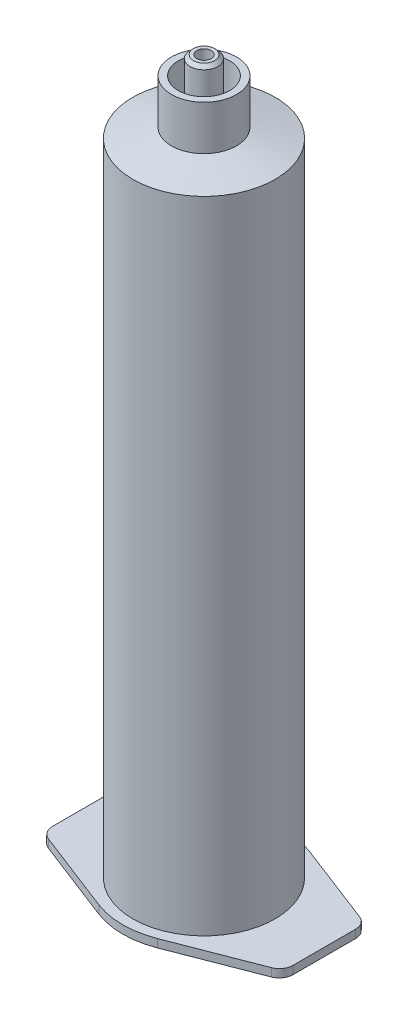
ISO-10303-21;
HEADER;
FILE_DESCRIPTION(('STEP AP214'),'2;1');
FILE_NAME('part.step','',(''),(''),'','','');
FILE_SCHEMA(('AUTOMOTIVE_DESIGN { 1 0 10303 214 1 1 1 1 }'));
ENDSEC;
DATA;
#1=APPLICATION_CONTEXT('core data for automotive mechanical design processes');
#2=APPLICATION_PROTOCOL_DEFINITION('international standard','automotive_design',2000,#1);
#3=PRODUCT_CONTEXT('',#1,'mechanical');
#4=PRODUCT('Part','Part','',(#3));
#5=PRODUCT_RELATED_PRODUCT_CATEGORY('part','',(#4));
#6=PRODUCT_DEFINITION_FORMATION('','',#4);
#7=PRODUCT_DEFINITION_CONTEXT('part definition',#1,'design');
#8=PRODUCT_DEFINITION('design','',#6,#7);
#9=PRODUCT_DEFINITION_SHAPE('','',#8);
#10=(LENGTH_UNIT() NAMED_UNIT(*) SI_UNIT(.MILLI.,.METRE.));
#11=(NAMED_UNIT(*) PLANE_ANGLE_UNIT() SI_UNIT($,.RADIAN.));
#12=(NAMED_UNIT(*) SI_UNIT($,.STERADIAN.) SOLID_ANGLE_UNIT());
#13=UNCERTAINTY_MEASURE_WITH_UNIT(LENGTH_MEASURE(1.E-05),#10,'distance_accuracy_value','');
#14=(GEOMETRIC_REPRESENTATION_CONTEXT(3) GLOBAL_UNCERTAINTY_ASSIGNED_CONTEXT((#13)) GLOBAL_UNIT_ASSIGNED_CONTEXT((#10,
#11,#12)) REPRESENTATION_CONTEXT('',''));
#15=CARTESIAN_POINT('',(0.,0.,0.));
#16=DIRECTION('',(0.,0.,1.));
#17=DIRECTION('',(1.,0.,0.));
#18=AXIS2_PLACEMENT_3D('',#15,#16,#17);
#19=CARTESIAN_POINT('',(0.,0.,0.));
#20=DIRECTION('',(0.,1.,0.));
#21=DIRECTION('',(0.,0.,1.));
#22=AXIS2_PLACEMENT_3D('',#19,#20,#21);
#23=CYLINDRICAL_SURFACE('',#22,3.8);
#24=CARTESIAN_POINT('',(0.,-3.44787174276673,0.));
#25=DIRECTION('',(0.,1.,0.));
#26=DIRECTION('',(0.,0.,1.));
#27=AXIS2_PLACEMENT_3D('',#24,#25,#26);
#28=CIRCLE('',#27,3.8);
#29=CARTESIAN_POINT('',(0.,-3.44787174276673,3.8));
#30=VERTEX_POINT('',#29);
#31=EDGE_CURVE('E210',#30,#30,#28,.T.);
#32=ORIENTED_EDGE('',*,*,#31,.F.);
#33=EDGE_LOOP('',(#32));
#34=FACE_BOUND('',#33,.T.);
#35=CARTESIAN_POINT('',(0.,2.8706391928476,0.));
#36=DIRECTION('',(0.,1.,0.));
#37=DIRECTION('',(0.,0.,1.));
#38=AXIS2_PLACEMENT_3D('',#35,#36,#37);
#39=CIRCLE('',#38,3.8);
#40=CARTESIAN_POINT('',(0.,2.8706391928476,3.8));
#41=VERTEX_POINT('',#40);
#42=EDGE_CURVE('E11',#41,#41,#39,.T.);
#43=ORIENTED_EDGE('',*,*,#42,.T.);
#44=EDGE_LOOP('',(#43));
#45=FACE_BOUND('',#44,.T.);
#46=ADVANCED_FACE('F37',(#34,#45),#23,.F.);
#47=CARTESIAN_POINT('',(3.8,2.8706391928476,0.));
#48=DIRECTION('',(0.,-1.,0.));
#49=DIRECTION('',(0.,0.,-1.));
#50=AXIS2_PLACEMENT_3D('',#47,#48,#49);
#51=PLANE('',#50);
#52=ORIENTED_EDGE('',*,*,#42,.F.);
#53=EDGE_LOOP('',(#52));
#54=FACE_BOUND('',#53,.T.);
#55=CARTESIAN_POINT('',(0.,2.8706391928476,0.));
#56=DIRECTION('',(0.,1.,0.));
#57=DIRECTION('',(0.,0.,1.));
#58=AXIS2_PLACEMENT_3D('',#55,#56,#57);
#59=CIRCLE('',#58,4.8);
#60=CARTESIAN_POINT('',(0.,2.8706391928476,4.8));
#61=VERTEX_POINT('',#60);
#62=EDGE_CURVE('E45',#61,#61,#59,.T.);
#63=ORIENTED_EDGE('',*,*,#62,.T.);
#64=EDGE_LOOP('',(#63));
#65=FACE_BOUND('',#64,.T.);
#66=ADVANCED_FACE('F241',(#54,#65),#51,.F.);
#67=CARTESIAN_POINT('',(0.,0.,0.));
#68=DIRECTION('',(0.,1.,0.));
#69=DIRECTION('',(0.,0.,1.));
#70=AXIS2_PLACEMENT_3D('',#67,#68,#69);
#71=CYLINDRICAL_SURFACE('',#70,4.8);
#72=ORIENTED_EDGE('',*,*,#62,.F.);
#73=EDGE_LOOP('',(#72));
#74=FACE_BOUND('',#73,.T.);
#75=CARTESIAN_POINT('',(0.,-3.69884025983921,0.));
#76=DIRECTION('',(0.,1.,0.));
#77=DIRECTION('',(0.,0.,1.));
#78=AXIS2_PLACEMENT_3D('',#75,#76,#77);
#79=CIRCLE('',#78,4.8);
#80=CARTESIAN_POINT('',(0.,-3.69884025983921,4.8));
#81=VERTEX_POINT('',#80);
#82=EDGE_CURVE('E236',#81,#81,#79,.T.);
#83=ORIENTED_EDGE('',*,*,#82,.T.);
#84=EDGE_LOOP('',(#83));
#85=FACE_BOUND('',#84,.T.);
#86=ADVANCED_FACE('F243',(#74,#85),#71,.T.);
#87=CARTESIAN_POINT('',(0.,-5.12936080715239,0.));
#88=DIRECTION('',(0.,-1.,0.));
#89=DIRECTION('',(0.,0.,-1.));
#90=AXIS2_PLACEMENT_3D('',#87,#88,#89);
#91=CONICAL_SURFACE('',#90,10.5,1.32490632612181);
#92=ORIENTED_EDGE('',*,*,#82,.F.);
#93=EDGE_LOOP('',(#92));
#94=FACE_BOUND('',#93,.T.);
#95=CARTESIAN_POINT('',(0.,-5.12936080715239,0.));
#96=DIRECTION('',(0.,1.,0.));
#97=DIRECTION('',(0.,0.,1.));
#98=AXIS2_PLACEMENT_3D('',#95,#96,#97);
#99=CIRCLE('',#98,10.5);
#100=CARTESIAN_POINT('',(0.,-5.12936080715239,10.5));
#101=VERTEX_POINT('',#100);
#102=EDGE_CURVE('E231',#101,#101,#99,.T.);
#103=ORIENTED_EDGE('',*,*,#102,.T.);
#104=EDGE_LOOP('',(#103));
#105=FACE_BOUND('',#104,.T.);
#106=ADVANCED_FACE('F246',(#94,#105),#91,.T.);
#107=CARTESIAN_POINT('',(0.,0.,0.));
#108=DIRECTION('',(0.,1.,0.));
#109=DIRECTION('',(0.,0.,1.));
#110=AXIS2_PLACEMENT_3D('',#107,#108,#109);
#111=CYLINDRICAL_SURFACE('',#110,10.5);
#112=ORIENTED_EDGE('',*,*,#102,.F.);
#113=EDGE_LOOP('',(#112));
#114=FACE_BOUND('',#113,.T.);
#115=CARTESIAN_POINT('',(0.,-99.6293608071524,0.));
#116=DIRECTION('',(0.,1.,0.));
#117=DIRECTION('',(0.,0.,1.));
#118=AXIS2_PLACEMENT_3D('',#115,#116,#117);
#119=CIRCLE('',#118,10.5);
#120=CARTESIAN_POINT('',(0.,-99.6293608071524,10.5));
#121=VERTEX_POINT('',#120);
#122=EDGE_CURVE('E209',#121,#121,#119,.T.);
#123=ORIENTED_EDGE('',*,*,#122,.T.);
#124=EDGE_LOOP('',(#123));
#125=FACE_BOUND('',#124,.T.);
#126=ADVANCED_FACE('F252',(#114,#125),#111,.T.);
#127=CARTESIAN_POINT('',(0.,0.,0.));
#128=DIRECTION('',(0.,1.,0.));
#129=DIRECTION('',(0.,0.,1.));
#130=AXIS2_PLACEMENT_3D('',#127,#128,#129);
#131=CYLINDRICAL_SURFACE('',#130,9.50000000000001);
#132=CARTESIAN_POINT('',(0.,-5.90940402452407,0.));
#133=DIRECTION('',(0.,1.,0.));
#134=DIRECTION('',(0.,0.,1.));
#135=AXIS2_PLACEMENT_3D('',#132,#133,#134);
#136=CIRCLE('',#135,9.5);
#137=CARTESIAN_POINT('',(0.,-5.90940402452407,-9.5));
#138=VERTEX_POINT('',#137);
#139=EDGE_CURVE('E228',#138,#138,#136,.T.);
#140=ORIENTED_EDGE('',*,*,#139,.T.);
#141=EDGE_LOOP('',(#140));
#142=FACE_BOUND('',#141,.T.);
#143=CARTESIAN_POINT('',(0.,-100.829360807152,0.));
#144=DIRECTION('',(0.,-1.,0.));
#145=DIRECTION('',(0.,0.,-1.));
#146=AXIS2_PLACEMENT_3D('',#143,#144,#145);
#147=CIRCLE('',#146,9.50000000000001);
#148=CARTESIAN_POINT('',(0.,-100.829360807152,-9.50000000000001));
#149=VERTEX_POINT('',#148);
#150=EDGE_CURVE('E163',#149,#149,#147,.T.);
#151=ORIENTED_EDGE('',*,*,#150,.T.);
#152=EDGE_LOOP('',(#151));
#153=FACE_BOUND('',#152,.T.);
#154=ADVANCED_FACE('F258',(#142,#153),#131,.F.);
#155=CARTESIAN_POINT('',(0.,-3.78872005526155,0.));
#156=DIRECTION('',(0.,-1.,0.));
#157=DIRECTION('',(0.,0.,-1.));
#158=AXIS2_PLACEMENT_3D('',#155,#156,#157);
#159=CONICAL_SURFACE('',#158,1.05,1.32490632612181);
#160=CARTESIAN_POINT('',(0.,-3.78872005526155,0.));
#161=DIRECTION('',(0.,1.,0.));
#162=DIRECTION('',(0.,0.,1.));
#163=AXIS2_PLACEMENT_3D('',#160,#161,#162);
#164=CIRCLE('',#163,1.05);
#165=CARTESIAN_POINT('',(0.,-3.78872005526155,-1.05));
#166=VERTEX_POINT('',#165);
#167=EDGE_CURVE('E225',#166,#166,#164,.T.);
#168=CARTESIAN_POINT('',(0.,-5.90940402452407,-9.5));
#169=CARTESIAN_POINT('',(0.,-5.88731356651092,-9.41197916666667));
#170=CARTESIAN_POINT('',(0.,-5.86522310849777,-9.32395833333333));
#171=CARTESIAN_POINT('',(0.,-5.82104219247146,-9.14791666666667));
#172=CARTESIAN_POINT('',(0.,-5.79895173445831,-9.05989583333333));
#173=CARTESIAN_POINT('',(0.,-5.75477081843201,-8.88385416666667));
#174=CARTESIAN_POINT('',(0.,-5.73268036041886,-8.79583333333333));
#175=CARTESIAN_POINT('',(0.,-5.68849944439256,-8.61979166666666));
#176=CARTESIAN_POINT('',(0.,-5.66640898637941,-8.53177083333333));
#177=CARTESIAN_POINT('',(0.,-5.6222280703531,-8.35572916666667));
#178=CARTESIAN_POINT('',(0.,-5.60013761233995,-8.26770833333333));
#179=CARTESIAN_POINT('',(0.,-5.55595669631365,-8.09166666666667));
#180=CARTESIAN_POINT('',(0.,-5.5338662383005,-8.00364583333333));
#181=CARTESIAN_POINT('',(0.,-5.4896853222742,-7.82760416666667));
#182=CARTESIAN_POINT('',(0.,-5.46759486426105,-7.73958333333333));
#183=CARTESIAN_POINT('',(0.,-5.42341394823474,-7.56354166666667));
#184=CARTESIAN_POINT('',(0.,-5.40132349022159,-7.47552083333333));
#185=CARTESIAN_POINT('',(0.,-5.35714257419529,-7.29947916666667));
#186=CARTESIAN_POINT('',(0.,-5.33505211618214,-7.21145833333333));
#187=CARTESIAN_POINT('',(0.,-5.29087120015583,-7.03541666666667));
#188=CARTESIAN_POINT('',(0.,-5.26878074214268,-6.94739583333333));
#189=CARTESIAN_POINT('',(0.,-5.22459982611638,-6.77135416666667));
#190=CARTESIAN_POINT('',(0.,-5.20250936810323,-6.68333333333333));
#191=CARTESIAN_POINT('',(0.,-5.15832845207693,-6.50729166666667));
#192=CARTESIAN_POINT('',(0.,-5.13623799406378,-6.41927083333333));
#193=CARTESIAN_POINT('',(0.,-5.09205707803747,-6.24322916666667));
#194=CARTESIAN_POINT('',(0.,-5.06996662002432,-6.15520833333333));
#195=CARTESIAN_POINT('',(0.,-5.02578570399802,-5.97916666666667));
#196=CARTESIAN_POINT('',(0.,-5.00369524598487,-5.89114583333333));
#197=CARTESIAN_POINT('',(0.,-4.95951432995857,-5.71510416666667));
#198=CARTESIAN_POINT('',(0.,-4.93742387194542,-5.62708333333333));
#199=CARTESIAN_POINT('',(0.,-4.89324295591911,-5.45104166666667));
#200=CARTESIAN_POINT('',(0.,-4.87115249790596,-5.36302083333333));
#201=CARTESIAN_POINT('',(0.,-4.82697158187966,-5.18697916666667));
#202=CARTESIAN_POINT('',(0.,-4.80488112386651,-5.09895833333333));
#203=CARTESIAN_POINT('',(0.,-4.7607002078402,-4.92291666666667));
#204=CARTESIAN_POINT('',(0.,-4.73860974982705,-4.83489583333333));
#205=CARTESIAN_POINT('',(0.,-4.69442883380075,-4.65885416666667));
#206=CARTESIAN_POINT('',(0.,-4.6723383757876,-4.57083333333333));
#207=CARTESIAN_POINT('',(0.,-4.6281574597613,-4.39479166666667));
#208=CARTESIAN_POINT('',(0.,-4.60606700174815,-4.30677083333333));
#209=CARTESIAN_POINT('',(0.,-4.56188608572184,-4.13072916666667));
#210=CARTESIAN_POINT('',(0.,-4.53979562770869,-4.04270833333333));
#211=CARTESIAN_POINT('',(0.,-4.49561471168239,-3.86666666666667));
#212=CARTESIAN_POINT('',(0.,-4.47352425366924,-3.77864583333333));
#213=CARTESIAN_POINT('',(0.,-4.42934333764294,-3.60260416666667));
#214=CARTESIAN_POINT('',(0.,-4.40725287962979,-3.51458333333333));
#215=CARTESIAN_POINT('',(0.,-4.36307196360348,-3.33854166666667));
#216=CARTESIAN_POINT('',(0.,-4.34098150559033,-3.25052083333333));
#217=CARTESIAN_POINT('',(0.,-4.29680058956403,-3.07447916666667));
#218=CARTESIAN_POINT('',(0.,-4.27471013155088,-2.98645833333333));
#219=CARTESIAN_POINT('',(0.,-4.23052921552457,-2.81041666666667));
#220=CARTESIAN_POINT('',(0.,-4.20843875751142,-2.72239583333333));
#221=CARTESIAN_POINT('',(0.,-4.16425784148512,-2.54635416666667));
#222=CARTESIAN_POINT('',(0.,-4.14216738347197,-2.45833333333333));
#223=CARTESIAN_POINT('',(0.,-4.09798646744567,-2.28229166666667));
#224=CARTESIAN_POINT('',(0.,-4.07589600943252,-2.19427083333333));
#225=CARTESIAN_POINT('',(0.,-4.03171509340621,-2.01822916666667));
#226=CARTESIAN_POINT('',(0.,-4.00962463539306,-1.93020833333333));
#227=CARTESIAN_POINT('',(0.,-3.96544371936676,-1.75416666666667));
#228=CARTESIAN_POINT('',(0.,-3.94335326135361,-1.66614583333333));
#229=CARTESIAN_POINT('',(0.,-3.89917234532731,-1.49010416666667));
#230=CARTESIAN_POINT('',(0.,-3.87708188731415,-1.40208333333333));
#231=CARTESIAN_POINT('',(0.,-3.83290097128785,-1.22604166666667));
#232=CARTESIAN_POINT('',(0.,-3.8108105132747,-1.13802083333333));
#233=CARTESIAN_POINT('',(0.,-3.78872005526155,-1.05));
#234=B_SPLINE_CURVE_WITH_KNOTS('',3,(#168,#169,#170,#171,#172,#173,#174,#175,#176,#177,#178,
#179,#180,#181,#182,#183,#184,#185,#186,#187,#188,#189,#190,#191,#192,#193,#194,#195,#196,#197,
#198,#199,#200,#201,#202,#203,#204,#205,#206,#207,#208,#209,#210,#211,#212,#213,#214,#215,#216,
#217,#218,#219,#220,#221,#222,#223,#224,#225,#226,#227,#228,#229,#230,#231,#232,#233),
.UNSPECIFIED.,.F.,.F.,(4,2,2,2,2,2,2,2,2,2,2,2,2,2,2,2,2,2,2,2,2,2,2,2,2,2,2,2,2,2,2,2,4),(0.,
0.272251536126662,0.544503072253325,0.816754608379987,1.08900614450665,1.36125768063331,
1.63350921675997,1.90576075288664,2.1780122890133,2.45026382513996,2.72251536126662,
2.99476689739328,3.26701843351994,3.53926996964661,3.81152150577327,4.08377304189993,
4.35602457802659,4.62827611415326,4.90052765027992,5.17277918640658,5.44503072253324,
5.7172822586599,5.98953379478657,6.26178533091323,6.53403686703989,6.80628840316655,
7.07853993929321,7.35079147541988,7.62304301154654,7.8952945476732,8.16754608379986,
8.43979761992653,8.71204915605319),.UNSPECIFIED.);
#235=EDGE_CURVE('BSEAM316',#138,#166,#234,.T.);
#236=ORIENTED_EDGE('',*,*,#139,.F.);
#237=ORIENTED_EDGE('',*,*,#167,.T.);
#238=ORIENTED_EDGE('',*,*,#235,.T.);
#239=ORIENTED_EDGE('',*,*,#235,.F.);
#240=EDGE_LOOP('',(#236,#238,#237,#239));
#241=FACE_BOUND('',#240,.T.);
#242=ADVANCED_FACE('F316',(#241),#159,.F.);
#243=CARTESIAN_POINT('',(0.,0.,0.));
#244=DIRECTION('',(0.,1.,0.));
#245=DIRECTION('',(0.,0.,1.));
#246=AXIS2_PLACEMENT_3D('',#243,#244,#245);
#247=CYLINDRICAL_SURFACE('',#246,1.05);
#248=ORIENTED_EDGE('',*,*,#167,.F.);
#249=EDGE_LOOP('',(#248));
#250=FACE_BOUND('',#249,.T.);
#251=CARTESIAN_POINT('',(0.,5.5706391928476,0.));
#252=DIRECTION('',(0.,1.,0.));
#253=DIRECTION('',(0.,0.,1.));
#254=AXIS2_PLACEMENT_3D('',#251,#252,#253);
#255=CIRCLE('',#254,1.05);
#256=CARTESIAN_POINT('',(0.,5.5706391928476,1.05));
#257=VERTEX_POINT('',#256);
#258=EDGE_CURVE('E222',#257,#257,#255,.T.);
#259=ORIENTED_EDGE('',*,*,#258,.T.);
#260=EDGE_LOOP('',(#259));
#261=FACE_BOUND('',#260,.T.);
#262=ADVANCED_FACE('F312',(#250,#261),#247,.F.);
#263=CARTESIAN_POINT('',(1.05,5.5706391928476,0.));
#264=DIRECTION('',(0.,-1.,0.));
#265=DIRECTION('',(0.,0.,-1.));
#266=AXIS2_PLACEMENT_3D('',#263,#264,#265);
#267=PLANE('',#266);
#268=ORIENTED_EDGE('',*,*,#258,.F.);
#269=EDGE_LOOP('',(#268));
#270=FACE_BOUND('',#269,.T.);
#271=CARTESIAN_POINT('',(0.,5.5706391928476,0.));
#272=DIRECTION('',(0.,1.,0.));
#273=DIRECTION('',(0.,0.,1.));
#274=AXIS2_PLACEMENT_3D('',#271,#272,#273);
#275=CIRCLE('',#274,1.55);
#276=CARTESIAN_POINT('',(0.,5.5706391928476,1.55));
#277=VERTEX_POINT('',#276);
#278=EDGE_CURVE('E219',#277,#277,#275,.T.);
#279=ORIENTED_EDGE('',*,*,#278,.T.);
#280=EDGE_LOOP('',(#279));
#281=FACE_BOUND('',#280,.T.);
#282=ADVANCED_FACE('F308',(#270,#281),#267,.F.);
#283=CARTESIAN_POINT('',(0.,5.0706391928476,0.));
#284=DIRECTION('',(0.,-1.,0.));
#285=DIRECTION('',(0.,0.,-1.));
#286=AXIS2_PLACEMENT_3D('',#283,#284,#285);
#287=CONICAL_SURFACE('',#286,2.05,0.785398163397449);
#288=ORIENTED_EDGE('',*,*,#278,.F.);
#289=EDGE_LOOP('',(#288));
#290=FACE_BOUND('',#289,.T.);
#291=CARTESIAN_POINT('',(0.,5.0706391928476,0.));
#292=DIRECTION('',(0.,1.,0.));
#293=DIRECTION('',(0.,0.,1.));
#294=AXIS2_PLACEMENT_3D('',#291,#292,#293);
#295=CIRCLE('',#294,2.05);
#296=CARTESIAN_POINT('',(0.,5.0706391928476,2.05));
#297=VERTEX_POINT('',#296);
#298=EDGE_CURVE('E216',#297,#297,#295,.T.);
#299=ORIENTED_EDGE('',*,*,#298,.T.);
#300=EDGE_LOOP('',(#299));
#301=FACE_BOUND('',#300,.T.);
#302=ADVANCED_FACE('F299',(#290,#301),#287,.T.);
#303=CARTESIAN_POINT('',(0.,0.,0.));
#304=DIRECTION('',(0.,1.,0.));
#305=DIRECTION('',(0.,0.,1.));
#306=AXIS2_PLACEMENT_3D('',#303,#304,#305);
#307=CYLINDRICAL_SURFACE('',#306,2.05);
#308=ORIENTED_EDGE('',*,*,#298,.F.);
#309=EDGE_LOOP('',(#308));
#310=FACE_BOUND('',#309,.T.);
#311=CARTESIAN_POINT('',(0.,-3.00867683788987,0.));
#312=DIRECTION('',(0.,1.,0.));
#313=DIRECTION('',(0.,0.,1.));
#314=AXIS2_PLACEMENT_3D('',#311,#312,#313);
#315=CIRCLE('',#314,2.05);
#316=CARTESIAN_POINT('',(0.,-3.00867683788987,2.05));
#317=VERTEX_POINT('',#316);
#318=EDGE_CURVE('E213',#317,#317,#315,.T.);
#319=ORIENTED_EDGE('',*,*,#318,.T.);
#320=EDGE_LOOP('',(#319));
#321=FACE_BOUND('',#320,.T.);
#322=ADVANCED_FACE('F291',(#310,#321),#307,.T.);
#323=CARTESIAN_POINT('',(0.,-3.44787174276673,0.));
#324=DIRECTION('',(0.,-1.,0.));
#325=DIRECTION('',(0.,0.,-1.));
#326=AXIS2_PLACEMENT_3D('',#323,#324,#325);
#327=CONICAL_SURFACE('',#326,3.8,1.32490632612181);
#328=ORIENTED_EDGE('',*,*,#318,.F.);
#329=EDGE_LOOP('',(#328));
#330=FACE_BOUND('',#329,.T.);
#331=ORIENTED_EDGE('',*,*,#31,.T.);
#332=EDGE_LOOP('',(#331));
#333=FACE_BOUND('',#332,.T.);
#334=ADVANCED_FACE('F289',(#330,#333),#327,.T.);
#335=CARTESIAN_POINT('',(-15.75,-100.829360807152,-4.62926612227508));
#336=DIRECTION('',(0.,-1.,0.));
#337=DIRECTION('',(0.,0.,-1.));
#338=AXIS2_PLACEMENT_3D('',#335,#336,#337);
#339=PLANE('',#338);
#340=CARTESIAN_POINT('',(-15.75,-100.829360807152,-4.62926612227508));
#341=DIRECTION('',(0.,-1.,0.));
#342=DIRECTION('',(0.,0.,-1.));
#343=AXIS2_PLACEMENT_3D('',#340,#341,#342);
#344=CIRCLE('',#343,2.);
#345=CARTESIAN_POINT('',(-17.75,-100.829360807152,-4.62926612227507));
#346=VERTEX_POINT('',#345);
#347=CARTESIAN_POINT('',(-16.4715923171119,-100.829360807152,-6.49455551748567));
#348=VERTEX_POINT('',#347);
#349=EDGE_CURVE('E182',#346,#348,#344,.T.);
#350=ORIENTED_EDGE('',*,*,#349,.T.);
#351=DIRECTION('',(0.932644697605291,0.,-0.360796158555958));
#352=VECTOR('',#351,1.);
#353=CARTESIAN_POINT('',(-16.4715923171119,-100.829360807152,-6.49455551748567));
#354=LINE('',#353,#352);
#355=CARTESIAN_POINT('',(-4.3295539026715,-100.829360807152,-11.1917363712635));
#356=VERTEX_POINT('',#355);
#357=EDGE_CURVE('E109',#348,#356,#354,.T.);
#358=ORIENTED_EDGE('',*,*,#357,.T.);
#359=CARTESIAN_POINT('',(0.,-100.829360807152,0.));
#360=DIRECTION('',(0.,-1.,0.));
#361=DIRECTION('',(0.,0.,-1.));
#362=AXIS2_PLACEMENT_3D('',#359,#360,#361);
#363=CIRCLE('',#362,12.);
#364=CARTESIAN_POINT('',(4.3295539026715,-100.829360807152,-11.1917363712635));
#365=VERTEX_POINT('',#364);
#366=EDGE_CURVE('E333',#356,#365,#363,.T.);
#367=ORIENTED_EDGE('',*,*,#366,.T.);
#368=DIRECTION('',(0.93264469760529,0.,0.360796158555959));
#369=VECTOR('',#368,1.);
#370=CARTESIAN_POINT('',(16.4715923171119,-100.829360807152,-6.49455551748566));
#371=LINE('',#370,#369);
#372=CARTESIAN_POINT('',(16.4715923171119,-100.829360807152,-6.49455551748566));
#373=VERTEX_POINT('',#372);
#374=EDGE_CURVE('E335',#365,#373,#371,.T.);
#375=ORIENTED_EDGE('',*,*,#374,.T.);
#376=CARTESIAN_POINT('',(15.75,-100.829360807152,-4.62926612227508));
#377=DIRECTION('',(0.,-1.,0.));
#378=DIRECTION('',(0.,0.,-1.));
#379=AXIS2_PLACEMENT_3D('',#376,#377,#378);
#380=CIRCLE('',#379,2.);
#381=CARTESIAN_POINT('',(17.75,-100.829360807152,-4.62926612227507));
#382=VERTEX_POINT('',#381);
#383=EDGE_CURVE('E337',#373,#382,#380,.T.);
#384=ORIENTED_EDGE('',*,*,#383,.T.);
#385=DIRECTION('',(0.,0.,1.));
#386=VECTOR('',#385,1.);
#387=CARTESIAN_POINT('',(17.75,-100.829360807152,4.62926612227507));
#388=LINE('',#387,#386);
#389=CARTESIAN_POINT('',(17.75,-100.829360807152,4.62926612227507));
#390=VERTEX_POINT('',#389);
#391=EDGE_CURVE('E339',#382,#390,#388,.T.);
#392=ORIENTED_EDGE('',*,*,#391,.T.);
#393=CARTESIAN_POINT('',(15.75,-100.829360807152,4.62926612227508));
#394=DIRECTION('',(0.,-1.,0.));
#395=DIRECTION('',(0.,0.,1.));
#396=AXIS2_PLACEMENT_3D('',#393,#394,#395);
#397=CIRCLE('',#396,2.);
#398=CARTESIAN_POINT('',(16.4715923171119,-100.829360807152,6.49455551748567));
#399=VERTEX_POINT('',#398);
#400=EDGE_CURVE('E341',#390,#399,#397,.T.);
#401=ORIENTED_EDGE('',*,*,#400,.T.);
#402=DIRECTION('',(-0.932644697605291,0.,0.360796158555958));
#403=VECTOR('',#402,1.);
#404=CARTESIAN_POINT('',(16.4715923171119,-100.829360807152,6.49455551748567));
#405=LINE('',#404,#403);
#406=CARTESIAN_POINT('',(4.32955390267149,-100.829360807152,11.1917363712635));
#407=VERTEX_POINT('',#406);
#408=EDGE_CURVE('E343',#399,#407,#405,.T.);
#409=ORIENTED_EDGE('',*,*,#408,.T.);
#410=CARTESIAN_POINT('',(0.,-100.829360807152,0.));
#411=DIRECTION('',(0.,-1.,0.));
#412=DIRECTION('',(0.,0.,-1.));
#413=AXIS2_PLACEMENT_3D('',#410,#411,#412);
#414=CIRCLE('',#413,12.);
#415=CARTESIAN_POINT('',(-4.3295539026715,-100.829360807152,11.1917363712635));
#416=VERTEX_POINT('',#415);
#417=EDGE_CURVE('E141',#407,#416,#414,.T.);
#418=ORIENTED_EDGE('',*,*,#417,.T.);
#419=DIRECTION('',(-0.932644697605291,0.,-0.360796158555958));
#420=VECTOR('',#419,1.);
#421=CARTESIAN_POINT('',(-16.4715923171119,-100.829360807152,6.49455551748567));
#422=LINE('',#421,#420);
#423=CARTESIAN_POINT('',(-16.4715923171119,-100.829360807152,6.49455551748567));
#424=VERTEX_POINT('',#423);
#425=EDGE_CURVE('E134',#416,#424,#422,.T.);
#426=ORIENTED_EDGE('',*,*,#425,.T.);
#427=CARTESIAN_POINT('',(-15.75,-100.829360807152,4.62926612227508));
#428=DIRECTION('',(0.,-1.,0.));
#429=DIRECTION('',(0.,0.,1.));
#430=AXIS2_PLACEMENT_3D('',#427,#428,#429);
#431=CIRCLE('',#430,2.);
#432=CARTESIAN_POINT('',(-17.75,-100.829360807152,4.62926612227507));
#433=VERTEX_POINT('',#432);
#434=EDGE_CURVE('E139',#424,#433,#431,.T.);
#435=ORIENTED_EDGE('',*,*,#434,.T.);
#436=DIRECTION('',(0.,0.,-1.));
#437=VECTOR('',#436,1.);
#438=CARTESIAN_POINT('',(-17.75,-100.829360807152,4.62926612227507));
#439=LINE('',#438,#437);
#440=EDGE_CURVE('E53',#433,#346,#439,.T.);
#441=ORIENTED_EDGE('',*,*,#440,.T.);
#442=EDGE_LOOP('',(#350,#358,#367,#375,#384,#392,#401,#409,#418,#426,#435,#441));
#443=FACE_BOUND('',#442,.T.);
#444=ORIENTED_EDGE('',*,*,#150,.F.);
#445=EDGE_LOOP('',(#444));
#446=FACE_BOUND('',#445,.T.);
#447=ADVANCED_FACE('F136',(#443,#446),#339,.T.);
#448=CARTESIAN_POINT('',(-15.75,-99.6293608071524,-4.62926612227508));
#449=DIRECTION('',(0.,-1.,0.));
#450=DIRECTION('',(0.,0.,-1.));
#451=AXIS2_PLACEMENT_3D('',#448,#449,#450);
#452=PLANE('',#451);
#453=ORIENTED_EDGE('',*,*,#122,.F.);
#454=EDGE_LOOP('',(#453));
#455=FACE_BOUND('',#454,.T.);
#456=CARTESIAN_POINT('',(-15.75,-99.6293608071524,-4.62926612227508));
#457=DIRECTION('',(0.,-1.,0.));
#458=DIRECTION('',(0.,0.,-1.));
#459=AXIS2_PLACEMENT_3D('',#456,#457,#458);
#460=CIRCLE('',#459,2.);
#461=CARTESIAN_POINT('',(-17.75,-99.6293608071524,-4.62926612227507));
#462=VERTEX_POINT('',#461);
#463=CARTESIAN_POINT('',(-16.4715923171119,-99.6293608071524,-6.49455551748567));
#464=VERTEX_POINT('',#463);
#465=EDGE_CURVE('E159',#462,#464,#460,.T.);
#466=ORIENTED_EDGE('',*,*,#465,.F.);
#467=DIRECTION('',(0.,0.,-1.));
#468=VECTOR('',#467,1.);
#469=CARTESIAN_POINT('',(-17.75,-99.6293608071524,4.62926612227507));
#470=LINE('',#469,#468);
#471=CARTESIAN_POINT('',(-17.75,-99.6293608071524,4.62926612227507));
#472=VERTEX_POINT('',#471);
#473=EDGE_CURVE('E100',#472,#462,#470,.T.);
#474=ORIENTED_EDGE('',*,*,#473,.F.);
#475=CARTESIAN_POINT('',(-15.75,-99.6293608071524,4.62926612227508));
#476=DIRECTION('',(0.,-1.,0.));
#477=DIRECTION('',(0.,0.,1.));
#478=AXIS2_PLACEMENT_3D('',#475,#476,#477);
#479=CIRCLE('',#478,2.);
#480=CARTESIAN_POINT('',(-16.4715923171119,-99.6293608071524,6.49455551748567));
#481=VERTEX_POINT('',#480);
#482=EDGE_CURVE('E94',#481,#472,#479,.T.);
#483=ORIENTED_EDGE('',*,*,#482,.F.);
#484=DIRECTION('',(-0.932644697605291,0.,-0.360796158555958));
#485=VECTOR('',#484,1.);
#486=CARTESIAN_POINT('',(-16.4715923171119,-99.6293608071524,6.49455551748567));
#487=LINE('',#486,#485);
#488=CARTESIAN_POINT('',(-4.3295539026715,-99.6293608071524,11.1917363712635));
#489=VERTEX_POINT('',#488);
#490=EDGE_CURVE('E149',#489,#481,#487,.T.);
#491=ORIENTED_EDGE('',*,*,#490,.F.);
#492=CARTESIAN_POINT('',(0.,-99.6293608071524,0.));
#493=DIRECTION('',(0.,-1.,0.));
#494=DIRECTION('',(0.,0.,-1.));
#495=AXIS2_PLACEMENT_3D('',#492,#493,#494);
#496=CIRCLE('',#495,12.);
#497=CARTESIAN_POINT('',(4.32955390267149,-99.6293608071524,11.1917363712635));
#498=VERTEX_POINT('',#497);
#499=EDGE_CURVE('E177',#498,#489,#496,.T.);
#500=ORIENTED_EDGE('',*,*,#499,.F.);
#501=DIRECTION('',(-0.932644697605291,0.,0.360796158555958));
#502=VECTOR('',#501,1.);
#503=CARTESIAN_POINT('',(16.4715923171119,-99.6293608071524,6.49455551748567));
#504=LINE('',#503,#502);
#505=CARTESIAN_POINT('',(16.4715923171119,-99.6293608071524,6.49455551748567));
#506=VERTEX_POINT('',#505);
#507=EDGE_CURVE('E175',#506,#498,#504,.T.);
#508=ORIENTED_EDGE('',*,*,#507,.F.);
#509=CARTESIAN_POINT('',(15.75,-99.6293608071524,4.62926612227508));
#510=DIRECTION('',(0.,-1.,0.));
#511=DIRECTION('',(0.,0.,1.));
#512=AXIS2_PLACEMENT_3D('',#509,#510,#511);
#513=CIRCLE('',#512,2.);
#514=CARTESIAN_POINT('',(17.75,-99.6293608071524,4.62926612227507));
#515=VERTEX_POINT('',#514);
#516=EDGE_CURVE('E173',#515,#506,#513,.T.);
#517=ORIENTED_EDGE('',*,*,#516,.F.);
#518=DIRECTION('',(0.,0.,1.));
#519=VECTOR('',#518,1.);
#520=CARTESIAN_POINT('',(17.75,-99.6293608071524,4.62926612227507));
#521=LINE('',#520,#519);
#522=CARTESIAN_POINT('',(17.75,-99.6293608071524,-4.62926612227507));
#523=VERTEX_POINT('',#522);
#524=EDGE_CURVE('E171',#523,#515,#521,.T.);
#525=ORIENTED_EDGE('',*,*,#524,.F.);
#526=CARTESIAN_POINT('',(15.75,-99.6293608071524,-4.62926612227508));
#527=DIRECTION('',(0.,-1.,0.));
#528=DIRECTION('',(0.,0.,-1.));
#529=AXIS2_PLACEMENT_3D('',#526,#527,#528);
#530=CIRCLE('',#529,2.);
#531=CARTESIAN_POINT('',(16.4715923171119,-99.6293608071524,-6.49455551748566));
#532=VERTEX_POINT('',#531);
#533=EDGE_CURVE('E169',#532,#523,#530,.T.);
#534=ORIENTED_EDGE('',*,*,#533,.F.);
#535=DIRECTION('',(0.93264469760529,0.,0.360796158555959));
#536=VECTOR('',#535,1.);
#537=CARTESIAN_POINT('',(16.4715923171119,-99.6293608071524,-6.49455551748566));
#538=LINE('',#537,#536);
#539=CARTESIAN_POINT('',(4.3295539026715,-99.6293608071524,-11.1917363712635));
#540=VERTEX_POINT('',#539);
#541=EDGE_CURVE('E167',#540,#532,#538,.T.);
#542=ORIENTED_EDGE('',*,*,#541,.F.);
#543=CARTESIAN_POINT('',(0.,-99.6293608071524,0.));
#544=DIRECTION('',(0.,-1.,0.));
#545=DIRECTION('',(0.,0.,-1.));
#546=AXIS2_PLACEMENT_3D('',#543,#544,#545);
#547=CIRCLE('',#546,12.);
#548=CARTESIAN_POINT('',(-4.3295539026715,-99.6293608071524,-11.1917363712635));
#549=VERTEX_POINT('',#548);
#550=EDGE_CURVE('E165',#549,#540,#547,.T.);
#551=ORIENTED_EDGE('',*,*,#550,.F.);
#552=DIRECTION('',(0.932644697605291,0.,-0.360796158555958));
#553=VECTOR('',#552,1.);
#554=CARTESIAN_POINT('',(-16.4715923171119,-99.6293608071524,-6.49455551748567));
#555=LINE('',#554,#553);
#556=EDGE_CURVE('E162',#464,#549,#555,.T.);
#557=ORIENTED_EDGE('',*,*,#556,.F.);
#558=EDGE_LOOP('',(#466,#474,#483,#491,#500,#508,#517,#525,#534,#542,#551,#557));
#559=FACE_BOUND('',#558,.T.);
#560=ADVANCED_FACE('F262',(#455,#559),#452,.F.);
#561=CARTESIAN_POINT('',(-15.75,-100.829360807152,-4.62926612227508));
#562=DIRECTION('',(0.,1.,0.));
#563=DIRECTION('',(0.,0.,1.));
#564=AXIS2_PLACEMENT_3D('',#561,#562,#563);
#565=CYLINDRICAL_SURFACE('',#564,2.);
#566=ORIENTED_EDGE('',*,*,#465,.T.);
#567=DIRECTION('',(0.,1.,0.));
#568=VECTOR('',#567,1.);
#569=CARTESIAN_POINT('',(-16.4715923171119,-100.829360807152,-6.49455551748567));
#570=LINE('',#569,#568);
#571=EDGE_CURVE('E207',#348,#464,#570,.T.);
#572=ORIENTED_EDGE('',*,*,#571,.F.);
#573=ORIENTED_EDGE('',*,*,#349,.F.);
#574=DIRECTION('',(0.,1.,0.));
#575=VECTOR('',#574,1.);
#576=CARTESIAN_POINT('',(-17.75,-100.829360807152,-4.62926612227507));
#577=LINE('',#576,#575);
#578=EDGE_CURVE('E155',#346,#462,#577,.T.);
#579=ORIENTED_EDGE('',*,*,#578,.T.);
#580=EDGE_LOOP('',(#566,#572,#573,#579));
#581=FACE_BOUND('',#580,.T.);
#582=ADVANCED_FACE('F265',(#581),#565,.T.);
#583=CARTESIAN_POINT('',(-16.4715923171119,-100.829360807152,-6.49455551748567));
#584=DIRECTION('',(0.360796158555958,0.,0.93264469760529));
#585=DIRECTION('',(0.932644697605291,0.,-0.360796158555958));
#586=AXIS2_PLACEMENT_3D('',#583,#584,#585);
#587=PLANE('',#586);
#588=ORIENTED_EDGE('',*,*,#556,.T.);
#589=DIRECTION('',(0.,1.,0.));
#590=VECTOR('',#589,1.);
#591=CARTESIAN_POINT('',(-4.3295539026715,-100.829360807152,-11.1917363712635));
#592=LINE('',#591,#590);
#593=EDGE_CURVE('E204',#356,#549,#592,.T.);
#594=ORIENTED_EDGE('',*,*,#593,.F.);
#595=ORIENTED_EDGE('',*,*,#357,.F.);
#596=ORIENTED_EDGE('',*,*,#571,.T.);
#597=EDGE_LOOP('',(#588,#594,#595,#596));
#598=FACE_BOUND('',#597,.T.);
#599=ADVANCED_FACE('F376',(#598),#587,.F.);
#600=CARTESIAN_POINT('',(0.,-100.829360807152,0.));
#601=DIRECTION('',(0.,1.,0.));
#602=DIRECTION('',(0.,0.,1.));
#603=AXIS2_PLACEMENT_3D('',#600,#601,#602);
#604=CYLINDRICAL_SURFACE('',#603,12.);
#605=ORIENTED_EDGE('',*,*,#550,.T.);
#606=DIRECTION('',(0.,1.,0.));
#607=VECTOR('',#606,1.);
#608=CARTESIAN_POINT('',(4.3295539026715,-100.829360807152,-11.1917363712635));
#609=LINE('',#608,#607);
#610=EDGE_CURVE('E201',#365,#540,#609,.T.);
#611=ORIENTED_EDGE('',*,*,#610,.F.);
#612=ORIENTED_EDGE('',*,*,#366,.F.);
#613=ORIENTED_EDGE('',*,*,#593,.T.);
#614=EDGE_LOOP('',(#605,#611,#612,#613));
#615=FACE_BOUND('',#614,.T.);
#616=ADVANCED_FACE('F375',(#615),#604,.T.);
#617=CARTESIAN_POINT('',(16.4715923171119,-100.829360807152,-6.49455551748566));
#618=DIRECTION('',(-0.360796158555959,0.,0.93264469760529));
#619=DIRECTION('',(0.932644697605291,0.,0.360796158555959));
#620=AXIS2_PLACEMENT_3D('',#617,#618,#619);
#621=PLANE('',#620);
#622=ORIENTED_EDGE('',*,*,#541,.T.);
#623=DIRECTION('',(0.,1.,0.));
#624=VECTOR('',#623,1.);
#625=CARTESIAN_POINT('',(16.4715923171119,-100.829360807152,-6.49455551748566));
#626=LINE('',#625,#624);
#627=EDGE_CURVE('E198',#373,#532,#626,.T.);
#628=ORIENTED_EDGE('',*,*,#627,.F.);
#629=ORIENTED_EDGE('',*,*,#374,.F.);
#630=ORIENTED_EDGE('',*,*,#610,.T.);
#631=EDGE_LOOP('',(#622,#628,#629,#630));
#632=FACE_BOUND('',#631,.T.);
#633=ADVANCED_FACE('F370',(#632),#621,.F.);
#634=CARTESIAN_POINT('',(15.75,-100.829360807152,-4.62926612227508));
#635=DIRECTION('',(0.,1.,0.));
#636=DIRECTION('',(0.,0.,1.));
#637=AXIS2_PLACEMENT_3D('',#634,#635,#636);
#638=CYLINDRICAL_SURFACE('',#637,2.);
#639=ORIENTED_EDGE('',*,*,#533,.T.);
#640=DIRECTION('',(0.,1.,0.));
#641=VECTOR('',#640,1.);
#642=CARTESIAN_POINT('',(17.75,-100.829360807152,-4.62926612227507));
#643=LINE('',#642,#641);
#644=EDGE_CURVE('E195',#382,#523,#643,.T.);
#645=ORIENTED_EDGE('',*,*,#644,.F.);
#646=ORIENTED_EDGE('',*,*,#383,.F.);
#647=ORIENTED_EDGE('',*,*,#627,.T.);
#648=EDGE_LOOP('',(#639,#645,#646,#647));
#649=FACE_BOUND('',#648,.T.);
#650=ADVANCED_FACE('F366',(#649),#638,.T.);
#651=CARTESIAN_POINT('',(17.75,-100.829360807152,4.62926612227507));
#652=DIRECTION('',(-1.,0.,0.));
#653=DIRECTION('',(0.,0.,1.));
#654=AXIS2_PLACEMENT_3D('',#651,#652,#653);
#655=PLANE('',#654);
#656=ORIENTED_EDGE('',*,*,#524,.T.);
#657=DIRECTION('',(0.,1.,0.));
#658=VECTOR('',#657,1.);
#659=CARTESIAN_POINT('',(17.75,-100.829360807152,4.62926612227507));
#660=LINE('',#659,#658);
#661=EDGE_CURVE('E192',#390,#515,#660,.T.);
#662=ORIENTED_EDGE('',*,*,#661,.F.);
#663=ORIENTED_EDGE('',*,*,#391,.F.);
#664=ORIENTED_EDGE('',*,*,#644,.T.);
#665=EDGE_LOOP('',(#656,#662,#663,#664));
#666=FACE_BOUND('',#665,.T.);
#667=ADVANCED_FACE('F362',(#666),#655,.F.);
#668=CARTESIAN_POINT('',(15.75,-100.829360807152,4.62926612227508));
#669=DIRECTION('',(0.,1.,0.));
#670=DIRECTION('',(0.,0.,1.));
#671=AXIS2_PLACEMENT_3D('',#668,#669,#670);
#672=CYLINDRICAL_SURFACE('',#671,2.);
#673=ORIENTED_EDGE('',*,*,#516,.T.);
#674=DIRECTION('',(0.,1.,0.));
#675=VECTOR('',#674,1.);
#676=CARTESIAN_POINT('',(16.4715923171119,-100.829360807152,6.49455551748567));
#677=LINE('',#676,#675);
#678=EDGE_CURVE('E189',#399,#506,#677,.T.);
#679=ORIENTED_EDGE('',*,*,#678,.F.);
#680=ORIENTED_EDGE('',*,*,#400,.F.);
#681=ORIENTED_EDGE('',*,*,#661,.T.);
#682=EDGE_LOOP('',(#673,#679,#680,#681));
#683=FACE_BOUND('',#682,.T.);
#684=ADVANCED_FACE('F358',(#683),#672,.T.);
#685=CARTESIAN_POINT('',(16.4715923171119,-100.829360807152,6.49455551748567));
#686=DIRECTION('',(-0.360796158555958,0.,-0.932644697605291));
#687=DIRECTION('',(-0.932644697605291,0.,0.360796158555958));
#688=AXIS2_PLACEMENT_3D('',#685,#686,#687);
#689=PLANE('',#688);
#690=ORIENTED_EDGE('',*,*,#507,.T.);
#691=DIRECTION('',(0.,1.,0.));
#692=VECTOR('',#691,1.);
#693=CARTESIAN_POINT('',(4.32955390267149,-100.829360807152,11.1917363712635));
#694=LINE('',#693,#692);
#695=EDGE_CURVE('E186',#407,#498,#694,.T.);
#696=ORIENTED_EDGE('',*,*,#695,.F.);
#697=ORIENTED_EDGE('',*,*,#408,.F.);
#698=ORIENTED_EDGE('',*,*,#678,.T.);
#699=EDGE_LOOP('',(#690,#696,#697,#698));
#700=FACE_BOUND('',#699,.T.);
#701=ADVANCED_FACE('F349',(#700),#689,.F.);
#702=CARTESIAN_POINT('',(0.,-100.829360807152,0.));
#703=DIRECTION('',(0.,1.,0.));
#704=DIRECTION('',(0.,0.,1.));
#705=AXIS2_PLACEMENT_3D('',#702,#703,#704);
#706=CYLINDRICAL_SURFACE('',#705,12.);
#707=ORIENTED_EDGE('',*,*,#499,.T.);
#708=DIRECTION('',(0.,1.,0.));
#709=VECTOR('',#708,1.);
#710=CARTESIAN_POINT('',(-4.3295539026715,-100.829360807152,11.1917363712635));
#711=LINE('',#710,#709);
#712=EDGE_CURVE('E150',#416,#489,#711,.T.);
#713=ORIENTED_EDGE('',*,*,#712,.F.);
#714=ORIENTED_EDGE('',*,*,#417,.F.);
#715=ORIENTED_EDGE('',*,*,#695,.T.);
#716=EDGE_LOOP('',(#707,#713,#714,#715));
#717=FACE_BOUND('',#716,.T.);
#718=ADVANCED_FACE('F353',(#717),#706,.T.);
#719=CARTESIAN_POINT('',(-16.4715923171119,-100.829360807152,6.49455551748567));
#720=DIRECTION('',(0.360796158555958,0.,-0.932644697605291));
#721=DIRECTION('',(-0.932644697605291,0.,-0.360796158555958));
#722=AXIS2_PLACEMENT_3D('',#719,#720,#721);
#723=PLANE('',#722);
#724=ORIENTED_EDGE('',*,*,#490,.T.);
#725=DIRECTION('',(0.,1.,0.));
#726=VECTOR('',#725,1.);
#727=CARTESIAN_POINT('',(-16.4715923171119,-100.829360807152,6.49455551748567));
#728=LINE('',#727,#726);
#729=EDGE_CURVE('E146',#424,#481,#728,.T.);
#730=ORIENTED_EDGE('',*,*,#729,.F.);
#731=ORIENTED_EDGE('',*,*,#425,.F.);
#732=ORIENTED_EDGE('',*,*,#712,.T.);
#733=EDGE_LOOP('',(#724,#730,#731,#732));
#734=FACE_BOUND('',#733,.T.);
#735=ADVANCED_FACE('F147',(#734),#723,.F.);
#736=CARTESIAN_POINT('',(-15.75,-100.829360807152,4.62926612227508));
#737=DIRECTION('',(0.,1.,0.));
#738=DIRECTION('',(0.,0.,1.));
#739=AXIS2_PLACEMENT_3D('',#736,#737,#738);
#740=CYLINDRICAL_SURFACE('',#739,2.);
#741=ORIENTED_EDGE('',*,*,#482,.T.);
#742=DIRECTION('',(0.,1.,0.));
#743=VECTOR('',#742,1.);
#744=CARTESIAN_POINT('',(-17.75,-100.829360807152,4.62926612227507));
#745=LINE('',#744,#743);
#746=EDGE_CURVE('E151',#433,#472,#745,.T.);
#747=ORIENTED_EDGE('',*,*,#746,.F.);
#748=ORIENTED_EDGE('',*,*,#434,.F.);
#749=ORIENTED_EDGE('',*,*,#729,.T.);
#750=EDGE_LOOP('',(#741,#747,#748,#749));
#751=FACE_BOUND('',#750,.T.);
#752=ADVANCED_FACE('F153',(#751),#740,.T.);
#753=CARTESIAN_POINT('',(-17.75,-100.829360807152,4.62926612227507));
#754=DIRECTION('',(1.,0.,0.));
#755=DIRECTION('',(0.,0.,-1.));
#756=AXIS2_PLACEMENT_3D('',#753,#754,#755);
#757=PLANE('',#756);
#758=ORIENTED_EDGE('',*,*,#473,.T.);
#759=ORIENTED_EDGE('',*,*,#578,.F.);
#760=ORIENTED_EDGE('',*,*,#440,.F.);
#761=ORIENTED_EDGE('',*,*,#746,.T.);
#762=EDGE_LOOP('',(#758,#759,#760,#761));
#763=FACE_BOUND('',#762,.T.);
#764=ADVANCED_FACE('F272',(#763),#757,.F.);
#765=CLOSED_SHELL('',(#46,#66,#86,#106,#126,#154,#242,#262,#282,#302,#322,#334,#447,#560,#582,
#599,#616,#633,#650,#667,#684,#701,#718,#735,#752,#764));
#766=MANIFOLD_SOLID_BREP('B2',#765);
#767=ADVANCED_BREP_SHAPE_REPRESENTATION('',(#18,#766),#14);
#768=SHAPE_DEFINITION_REPRESENTATION(#9,#767);
ENDSEC;
END-ISO-10303-21;
